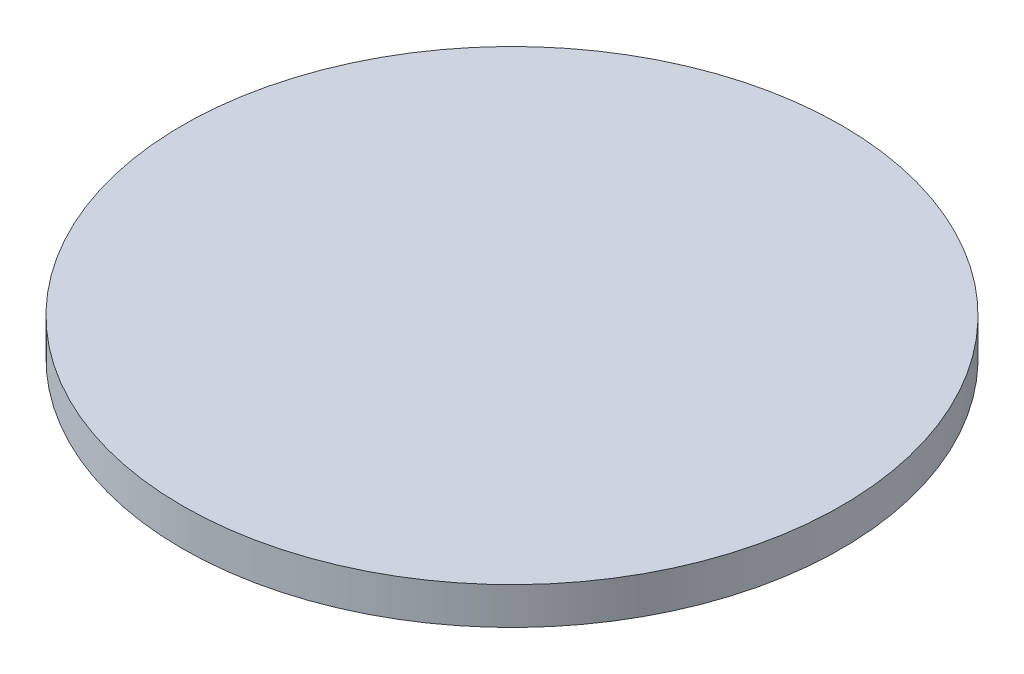
ISO-10303-21;
HEADER;
FILE_DESCRIPTION(('STEP AP214'),'2;1');
FILE_NAME('part.step','',(''),(''),'','','');
FILE_SCHEMA(('AUTOMOTIVE_DESIGN { 1 0 10303 214 1 1 1 1 }'));
ENDSEC;
DATA;
#1=APPLICATION_CONTEXT('core data for automotive mechanical design processes');
#2=APPLICATION_PROTOCOL_DEFINITION('international standard','automotive_design',2000,#1);
#3=PRODUCT_CONTEXT('',#1,'mechanical');
#4=PRODUCT('Part','Part','',(#3));
#5=PRODUCT_RELATED_PRODUCT_CATEGORY('part','',(#4));
#6=PRODUCT_DEFINITION_FORMATION('','',#4);
#7=PRODUCT_DEFINITION_CONTEXT('part definition',#1,'design');
#8=PRODUCT_DEFINITION('design','',#6,#7);
#9=PRODUCT_DEFINITION_SHAPE('','',#8);
#10=(LENGTH_UNIT() NAMED_UNIT(*) SI_UNIT(.MILLI.,.METRE.));
#11=(NAMED_UNIT(*) PLANE_ANGLE_UNIT() SI_UNIT($,.RADIAN.));
#12=(NAMED_UNIT(*) SI_UNIT($,.STERADIAN.) SOLID_ANGLE_UNIT());
#13=UNCERTAINTY_MEASURE_WITH_UNIT(LENGTH_MEASURE(1.E-05),#10,'distance_accuracy_value','');
#14=(GEOMETRIC_REPRESENTATION_CONTEXT(3) GLOBAL_UNCERTAINTY_ASSIGNED_CONTEXT((#13)) GLOBAL_UNIT_ASSIGNED_CONTEXT((#10,
#11,#12)) REPRESENTATION_CONTEXT('',''));
#15=CARTESIAN_POINT('',(0.,0.,0.));
#16=DIRECTION('',(0.,0.,1.));
#17=DIRECTION('',(1.,0.,0.));
#18=AXIS2_PLACEMENT_3D('',#15,#16,#17);
#19=CARTESIAN_POINT('',(0.,4.826,0.));
#20=DIRECTION('',(0.,-1.,0.));
#21=DIRECTION('',(0.,0.,-1.));
#22=AXIS2_PLACEMENT_3D('',#19,#20,#21);
#23=CYLINDRICAL_SURFACE('',#22,85.725);
#24=CARTESIAN_POINT('',(0.,4.826,0.));
#25=DIRECTION('',(0.,1.,0.));
#26=DIRECTION('',(0.,0.,1.));
#27=AXIS2_PLACEMENT_3D('',#24,#25,#26);
#28=CIRCLE('',#27,85.725);
#29=CARTESIAN_POINT('',(0.,4.826,85.725));
#30=VERTEX_POINT('',#29);
#31=EDGE_CURVE('E10',#30,#30,#28,.T.);
#32=ORIENTED_EDGE('',*,*,#31,.F.);
#33=EDGE_LOOP('',(#32));
#34=FACE_BOUND('',#33,.T.);
#35=CARTESIAN_POINT('',(0.,-4.826,0.));
#36=DIRECTION('',(0.,1.,0.));
#37=DIRECTION('',(0.,0.,1.));
#38=AXIS2_PLACEMENT_3D('',#35,#36,#37);
#39=CIRCLE('',#38,85.725);
#40=CARTESIAN_POINT('',(0.,-4.826,85.725));
#41=VERTEX_POINT('',#40);
#42=EDGE_CURVE('E40',#41,#41,#39,.T.);
#43=ORIENTED_EDGE('',*,*,#42,.T.);
#44=EDGE_LOOP('',(#43));
#45=FACE_BOUND('',#44,.T.);
#46=ADVANCED_FACE('F37',(#34,#45),#23,.T.);
#47=CARTESIAN_POINT('',(0.,4.826,0.));
#48=DIRECTION('',(0.,1.,0.));
#49=DIRECTION('',(0.,0.,1.));
#50=AXIS2_PLACEMENT_3D('',#47,#48,#49);
#51=PLANE('',#50);
#52=ORIENTED_EDGE('',*,*,#31,.T.);
#53=EDGE_LOOP('',(#52));
#54=FACE_BOUND('',#53,.T.);
#55=ADVANCED_FACE('F54',(#54),#51,.T.);
#56=CARTESIAN_POINT('',(0.,-4.826,0.));
#57=DIRECTION('',(0.,1.,0.));
#58=DIRECTION('',(0.,0.,1.));
#59=AXIS2_PLACEMENT_3D('',#56,#57,#58);
#60=PLANE('',#59);
#61=ORIENTED_EDGE('',*,*,#42,.F.);
#62=EDGE_LOOP('',(#61));
#63=FACE_BOUND('',#62,.T.);
#64=ADVANCED_FACE('F52',(#63),#60,.F.);
#65=CLOSED_SHELL('',(#46,#55,#64));
#66=MANIFOLD_SOLID_BREP('B2',#65);
#67=ADVANCED_BREP_SHAPE_REPRESENTATION('',(#18,#66),#14);
#68=SHAPE_DEFINITION_REPRESENTATION(#9,#67);
ENDSEC;
END-ISO-10303-21;
